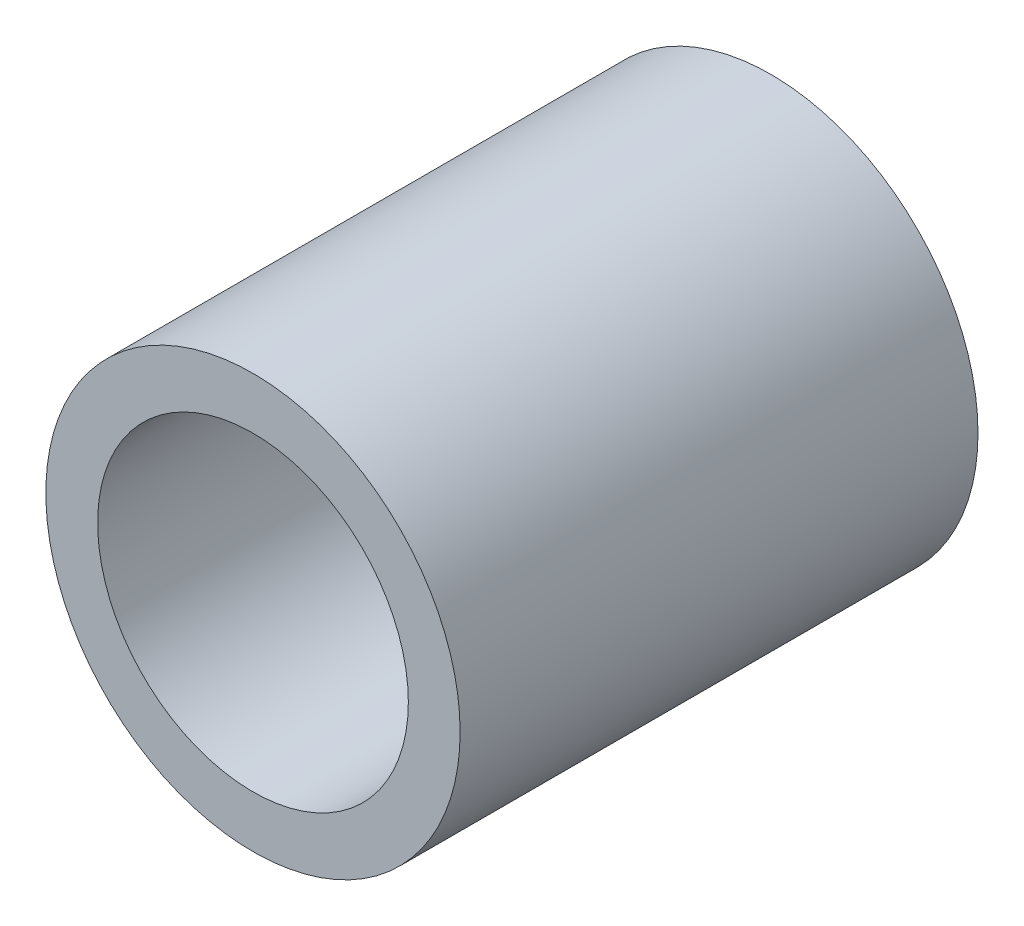
ISO-10303-21;
HEADER;
FILE_DESCRIPTION(('STEP AP214'),'2;1');
FILE_NAME('part.step','',(''),(''),'','','');
FILE_SCHEMA(('AUTOMOTIVE_DESIGN { 1 0 10303 214 1 1 1 1 }'));
ENDSEC;
DATA;
#1=APPLICATION_CONTEXT('core data for automotive mechanical design processes');
#2=APPLICATION_PROTOCOL_DEFINITION('international standard','automotive_design',2000,#1);
#3=PRODUCT_CONTEXT('',#1,'mechanical');
#4=PRODUCT('Part','Part','',(#3));
#5=PRODUCT_RELATED_PRODUCT_CATEGORY('part','',(#4));
#6=PRODUCT_DEFINITION_FORMATION('','',#4);
#7=PRODUCT_DEFINITION_CONTEXT('part definition',#1,'design');
#8=PRODUCT_DEFINITION('design','',#6,#7);
#9=PRODUCT_DEFINITION_SHAPE('','',#8);
#10=(LENGTH_UNIT() NAMED_UNIT(*) SI_UNIT(.MILLI.,.METRE.));
#11=(NAMED_UNIT(*) PLANE_ANGLE_UNIT() SI_UNIT($,.RADIAN.));
#12=(NAMED_UNIT(*) SI_UNIT($,.STERADIAN.) SOLID_ANGLE_UNIT());
#13=UNCERTAINTY_MEASURE_WITH_UNIT(LENGTH_MEASURE(1.E-05),#10,'distance_accuracy_value','');
#14=(GEOMETRIC_REPRESENTATION_CONTEXT(3) GLOBAL_UNCERTAINTY_ASSIGNED_CONTEXT((#13)) GLOBAL_UNIT_ASSIGNED_CONTEXT((#10,
#11,#12)) REPRESENTATION_CONTEXT('',''));
#15=CARTESIAN_POINT('',(0.,0.,0.));
#16=DIRECTION('',(0.,0.,1.));
#17=DIRECTION('',(1.,0.,0.));
#18=AXIS2_PLACEMENT_3D('',#15,#16,#17);
#19=CARTESIAN_POINT('',(-1.26025658193734,1.68511414149511,6.));
#20=DIRECTION('',(0.,0.,-1.));
#21=DIRECTION('',(-1.,0.,0.));
#22=AXIS2_PLACEMENT_3D('',#19,#20,#21);
#23=CYLINDRICAL_SURFACE('',#22,2.4);
#24=CARTESIAN_POINT('',(-1.26025658193734,1.68511414149511,6.));
#25=DIRECTION('',(0.,0.,1.));
#26=DIRECTION('',(1.,0.,0.));
#27=AXIS2_PLACEMENT_3D('',#24,#25,#26);
#28=CIRCLE('',#27,2.4);
#29=CARTESIAN_POINT('',(1.13974341806266,1.68511414149511,6.));
#30=VERTEX_POINT('',#29);
#31=EDGE_CURVE('E10',#30,#30,#28,.T.);
#32=ORIENTED_EDGE('',*,*,#31,.F.);
#33=EDGE_LOOP('',(#32));
#34=FACE_BOUND('',#33,.T.);
#35=CARTESIAN_POINT('',(-1.26025658193734,1.68511414149511,0.));
#36=DIRECTION('',(0.,0.,1.));
#37=DIRECTION('',(1.,0.,0.));
#38=AXIS2_PLACEMENT_3D('',#35,#36,#37);
#39=CIRCLE('',#38,2.4);
#40=CARTESIAN_POINT('',(1.13974341806266,1.68511414149511,0.));
#41=VERTEX_POINT('',#40);
#42=EDGE_CURVE('E34',#41,#41,#39,.T.);
#43=ORIENTED_EDGE('',*,*,#42,.T.);
#44=EDGE_LOOP('',(#43));
#45=FACE_BOUND('',#44,.T.);
#46=ADVANCED_FACE('F31',(#34,#45),#23,.T.);
#47=CARTESIAN_POINT('',(-1.26025658193734,1.68511414149511,6.));
#48=DIRECTION('',(0.,0.,1.));
#49=DIRECTION('',(1.,0.,0.));
#50=AXIS2_PLACEMENT_3D('',#47,#48,#49);
#51=PLANE('',#50);
#52=CARTESIAN_POINT('',(-1.26025658193734,1.68511414149511,6.));
#53=DIRECTION('',(0.,0.,1.));
#54=DIRECTION('',(1.,0.,0.));
#55=AXIS2_PLACEMENT_3D('',#52,#53,#54);
#56=CIRCLE('',#55,1.8);
#57=CARTESIAN_POINT('',(0.539743418062656,1.68511414149511,6.));
#58=VERTEX_POINT('',#57);
#59=EDGE_CURVE('E41',#58,#58,#56,.T.);
#60=ORIENTED_EDGE('',*,*,#59,.F.);
#61=EDGE_LOOP('',(#60));
#62=FACE_BOUND('',#61,.T.);
#63=ORIENTED_EDGE('',*,*,#31,.T.);
#64=EDGE_LOOP('',(#63));
#65=FACE_BOUND('',#64,.T.);
#66=ADVANCED_FACE('F52',(#62,#65),#51,.T.);
#67=CARTESIAN_POINT('',(-1.26025658193734,1.68511414149511,0.));
#68=DIRECTION('',(0.,0.,1.));
#69=DIRECTION('',(1.,0.,0.));
#70=AXIS2_PLACEMENT_3D('',#67,#68,#69);
#71=PLANE('',#70);
#72=CARTESIAN_POINT('',(-1.26025658193734,1.68511414149511,0.));
#73=DIRECTION('',(0.,0.,1.));
#74=DIRECTION('',(1.,0.,0.));
#75=AXIS2_PLACEMENT_3D('',#72,#73,#74);
#76=CIRCLE('',#75,1.8);
#77=CARTESIAN_POINT('',(0.539743418062656,1.68511414149511,0.));
#78=VERTEX_POINT('',#77);
#79=EDGE_CURVE('E43',#78,#78,#76,.T.);
#80=ORIENTED_EDGE('',*,*,#79,.T.);
#81=EDGE_LOOP('',(#80));
#82=FACE_BOUND('',#81,.T.);
#83=ORIENTED_EDGE('',*,*,#42,.F.);
#84=EDGE_LOOP('',(#83));
#85=FACE_BOUND('',#84,.T.);
#86=ADVANCED_FACE('F54',(#82,#85),#71,.F.);
#87=CARTESIAN_POINT('',(-1.26025658193734,1.68511414149511,6.));
#88=DIRECTION('',(0.,0.,-1.));
#89=DIRECTION('',(-1.,0.,0.));
#90=AXIS2_PLACEMENT_3D('',#87,#88,#89);
#91=CYLINDRICAL_SURFACE('',#90,1.8);
#92=ORIENTED_EDGE('',*,*,#59,.T.);
#93=EDGE_LOOP('',(#92));
#94=FACE_BOUND('',#93,.T.);
#95=ORIENTED_EDGE('',*,*,#79,.F.);
#96=EDGE_LOOP('',(#95));
#97=FACE_BOUND('',#96,.T.);
#98=ADVANCED_FACE('F49',(#94,#97),#91,.F.);
#99=CLOSED_SHELL('',(#46,#66,#86,#98));
#100=MANIFOLD_SOLID_BREP('B2',#99);
#101=ADVANCED_BREP_SHAPE_REPRESENTATION('',(#18,#100),#14);
#102=SHAPE_DEFINITION_REPRESENTATION(#9,#101);
ENDSEC;
END-ISO-10303-21;
